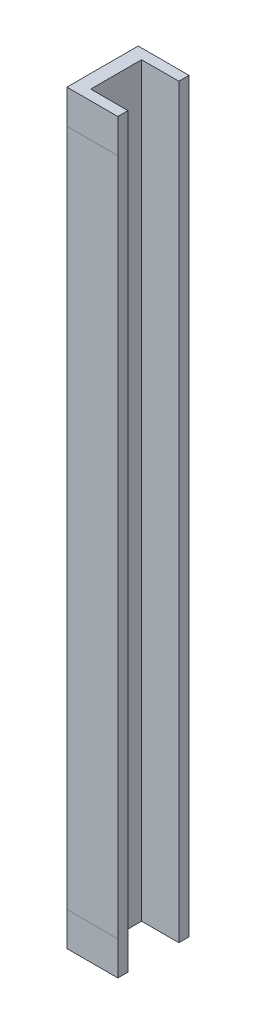
ISO-10303-21;
HEADER;
FILE_DESCRIPTION(('STEP AP214'),'2;1');
FILE_NAME('part.step','',(''),(''),'','','');
FILE_SCHEMA(('AUTOMOTIVE_DESIGN { 1 0 10303 214 1 1 1 1 }'));
ENDSEC;
DATA;
#1=APPLICATION_CONTEXT('core data for automotive mechanical design processes');
#2=APPLICATION_PROTOCOL_DEFINITION('international standard','automotive_design',2000,#1);
#3=PRODUCT_CONTEXT('',#1,'mechanical');
#4=PRODUCT('Part','Part','',(#3));
#5=PRODUCT_RELATED_PRODUCT_CATEGORY('part','',(#4));
#6=PRODUCT_DEFINITION_FORMATION('','',#4);
#7=PRODUCT_DEFINITION_CONTEXT('part definition',#1,'design');
#8=PRODUCT_DEFINITION('design','',#6,#7);
#9=PRODUCT_DEFINITION_SHAPE('','',#8);
#10=(LENGTH_UNIT() NAMED_UNIT(*) SI_UNIT(.MILLI.,.METRE.));
#11=(NAMED_UNIT(*) PLANE_ANGLE_UNIT() SI_UNIT($,.RADIAN.));
#12=(NAMED_UNIT(*) SI_UNIT($,.STERADIAN.) SOLID_ANGLE_UNIT());
#13=UNCERTAINTY_MEASURE_WITH_UNIT(LENGTH_MEASURE(1.E-05),#10,'distance_accuracy_value','');
#14=(GEOMETRIC_REPRESENTATION_CONTEXT(3) GLOBAL_UNCERTAINTY_ASSIGNED_CONTEXT((#13)) GLOBAL_UNIT_ASSIGNED_CONTEXT((#10,
#11,#12)) REPRESENTATION_CONTEXT('',''));
#15=CARTESIAN_POINT('',(0.,0.,0.));
#16=DIRECTION('',(0.,0.,1.));
#17=DIRECTION('',(1.,0.,0.));
#18=AXIS2_PLACEMENT_3D('',#15,#16,#17);
#19=CARTESIAN_POINT('',(0.,2200.,0.));
#20=DIRECTION('',(0.,0.,-1.));
#21=DIRECTION('',(-1.,0.,0.));
#22=AXIS2_PLACEMENT_3D('',#19,#20,#21);
#23=PLANE('',#22);
#24=DIRECTION('',(1.,0.,0.));
#25=VECTOR('',#24,1.);
#26=CARTESIAN_POINT('',(0.,100.,0.));
#27=LINE('',#26,#25);
#28=CARTESIAN_POINT('',(0.,100.,0.));
#29=VERTEX_POINT('',#28);
#30=CARTESIAN_POINT('',(150.,100.,0.));
#31=VERTEX_POINT('',#30);
#32=EDGE_CURVE('E12',#29,#31,#27,.T.);
#33=ORIENTED_EDGE('',*,*,#32,.F.);
#34=DIRECTION('',(0.,-1.,0.));
#35=VECTOR('',#34,1.);
#36=CARTESIAN_POINT('',(0.,2200.,0.));
#37=LINE('',#36,#35);
#38=CARTESIAN_POINT('',(0.,0.,0.));
#39=VERTEX_POINT('',#38);
#40=EDGE_CURVE('E160',#29,#39,#37,.T.);
#41=ORIENTED_EDGE('',*,*,#40,.T.);
#42=DIRECTION('',(1.,0.,0.));
#43=VECTOR('',#42,1.);
#44=CARTESIAN_POINT('',(0.,0.,0.));
#45=LINE('',#44,#43);
#46=CARTESIAN_POINT('',(150.,0.,0.));
#47=VERTEX_POINT('',#46);
#48=EDGE_CURVE('E221',#39,#47,#45,.T.);
#49=ORIENTED_EDGE('',*,*,#48,.T.);
#50=DIRECTION('',(0.,-1.,0.));
#51=VECTOR('',#50,1.);
#52=CARTESIAN_POINT('',(150.,2200.,0.));
#53=LINE('',#52,#51);
#54=EDGE_CURVE('E170',#31,#47,#53,.T.);
#55=ORIENTED_EDGE('',*,*,#54,.F.);
#56=EDGE_LOOP('',(#33,#41,#49,#55));
#57=FACE_BOUND('',#56,.T.);
#58=ADVANCED_FACE('F53',(#57),#23,.F.);
#59=CARTESIAN_POINT('',(0.,2100.,0.));
#60=VERTEX_POINT('',#59);
#61=EDGE_CURVE('E157',#60,#29,#37,.T.);
#62=ORIENTED_EDGE('',*,*,#61,.T.);
#63=ORIENTED_EDGE('',*,*,#32,.T.);
#64=CARTESIAN_POINT('',(150.,2100.,0.));
#65=VERTEX_POINT('',#64);
#66=EDGE_CURVE('E169',#65,#31,#53,.T.);
#67=ORIENTED_EDGE('',*,*,#66,.F.);
#68=DIRECTION('',(1.,0.,0.));
#69=VECTOR('',#68,1.);
#70=CARTESIAN_POINT('',(0.,2100.,0.));
#71=LINE('',#70,#69);
#72=EDGE_CURVE('E63',#60,#65,#71,.T.);
#73=ORIENTED_EDGE('',*,*,#72,.F.);
#74=EDGE_LOOP('',(#62,#63,#67,#73));
#75=FACE_BOUND('',#74,.T.);
#76=ADVANCED_FACE('F264',(#75),#23,.F.);
#77=CARTESIAN_POINT('',(0.,2200.,-210.));
#78=DIRECTION('',(1.,0.,0.));
#79=DIRECTION('',(0.,0.,-1.));
#80=AXIS2_PLACEMENT_3D('',#77,#78,#79);
#81=PLANE('',#80);
#82=DIRECTION('',(0.,0.,1.));
#83=VECTOR('',#82,1.);
#84=CARTESIAN_POINT('',(0.,0.,-210.));
#85=LINE('',#84,#83);
#86=CARTESIAN_POINT('',(0.,0.,-210.));
#87=VERTEX_POINT('',#86);
#88=EDGE_CURVE('E224',#87,#39,#85,.T.);
#89=ORIENTED_EDGE('',*,*,#88,.T.);
#90=ORIENTED_EDGE('',*,*,#40,.F.);
#91=ORIENTED_EDGE('',*,*,#61,.F.);
#92=CARTESIAN_POINT('',(0.,2200.,0.));
#93=VERTEX_POINT('',#92);
#94=EDGE_CURVE('E136',#93,#60,#37,.T.);
#95=ORIENTED_EDGE('',*,*,#94,.F.);
#96=DIRECTION('',(0.,0.,1.));
#97=VECTOR('',#96,1.);
#98=CARTESIAN_POINT('',(0.,2200.,-210.));
#99=LINE('',#98,#97);
#100=CARTESIAN_POINT('',(0.,2200.,-210.));
#101=VERTEX_POINT('',#100);
#102=EDGE_CURVE('E143',#101,#93,#99,.T.);
#103=ORIENTED_EDGE('',*,*,#102,.F.);
#104=DIRECTION('',(0.,-1.,0.));
#105=VECTOR('',#104,1.);
#106=CARTESIAN_POINT('',(0.,2200.,-210.));
#107=LINE('',#106,#105);
#108=EDGE_CURVE('E201',#101,#87,#107,.T.);
#109=ORIENTED_EDGE('',*,*,#108,.T.);
#110=EDGE_LOOP('',(#89,#90,#91,#95,#103,#109));
#111=FACE_BOUND('',#110,.T.);
#112=ADVANCED_FACE('F55',(#111),#81,.F.);
#113=ORIENTED_EDGE('',*,*,#94,.T.);
#114=ORIENTED_EDGE('',*,*,#72,.T.);
#115=CARTESIAN_POINT('',(150.,2200.,0.));
#116=VERTEX_POINT('',#115);
#117=EDGE_CURVE('E138',#116,#65,#53,.T.);
#118=ORIENTED_EDGE('',*,*,#117,.F.);
#119=DIRECTION('',(1.,0.,0.));
#120=VECTOR('',#119,1.);
#121=CARTESIAN_POINT('',(0.,2200.,0.));
#122=LINE('',#121,#120);
#123=EDGE_CURVE('E132',#93,#116,#122,.T.);
#124=ORIENTED_EDGE('',*,*,#123,.F.);
#125=EDGE_LOOP('',(#113,#114,#118,#124));
#126=FACE_BOUND('',#125,.T.);
#127=ADVANCED_FACE('F134',(#126),#23,.F.);
#128=CARTESIAN_POINT('',(150.,2200.,0.));
#129=DIRECTION('',(-1.,0.,0.));
#130=DIRECTION('',(0.,0.,1.));
#131=AXIS2_PLACEMENT_3D('',#128,#129,#130);
#132=PLANE('',#131);
#133=DIRECTION('',(0.,0.,-1.));
#134=VECTOR('',#133,1.);
#135=CARTESIAN_POINT('',(150.,0.,0.));
#136=LINE('',#135,#134);
#137=CARTESIAN_POINT('',(150.,0.,-30.));
#138=VERTEX_POINT('',#137);
#139=EDGE_CURVE('E218',#47,#138,#136,.T.);
#140=ORIENTED_EDGE('',*,*,#139,.T.);
#141=DIRECTION('',(0.,-1.,0.));
#142=VECTOR('',#141,1.);
#143=CARTESIAN_POINT('',(150.,2200.,-30.));
#144=LINE('',#143,#142);
#145=CARTESIAN_POINT('',(150.,2200.,-30.));
#146=VERTEX_POINT('',#145);
#147=EDGE_CURVE('E177',#146,#138,#144,.T.);
#148=ORIENTED_EDGE('',*,*,#147,.F.);
#149=DIRECTION('',(0.,0.,-1.));
#150=VECTOR('',#149,1.);
#151=CARTESIAN_POINT('',(150.,2200.,0.));
#152=LINE('',#151,#150);
#153=EDGE_CURVE('E142',#116,#146,#152,.T.);
#154=ORIENTED_EDGE('',*,*,#153,.F.);
#155=ORIENTED_EDGE('',*,*,#117,.T.);
#156=ORIENTED_EDGE('',*,*,#66,.T.);
#157=ORIENTED_EDGE('',*,*,#54,.T.);
#158=EDGE_LOOP('',(#140,#148,#154,#155,#156,#157));
#159=FACE_BOUND('',#158,.T.);
#160=ADVANCED_FACE('F263',(#159),#132,.F.);
#161=CARTESIAN_POINT('',(150.,2200.,-30.));
#162=DIRECTION('',(0.,0.,1.));
#163=DIRECTION('',(1.,0.,0.));
#164=AXIS2_PLACEMENT_3D('',#161,#162,#163);
#165=PLANE('',#164);
#166=DIRECTION('',(-1.,0.,0.));
#167=VECTOR('',#166,1.);
#168=CARTESIAN_POINT('',(150.,0.,-30.));
#169=LINE('',#168,#167);
#170=CARTESIAN_POINT('',(40.,0.,-30.));
#171=VERTEX_POINT('',#170);
#172=EDGE_CURVE('E215',#138,#171,#169,.T.);
#173=ORIENTED_EDGE('',*,*,#172,.T.);
#174=DIRECTION('',(0.,-1.,0.));
#175=VECTOR('',#174,1.);
#176=CARTESIAN_POINT('',(40.,2200.,-30.));
#177=LINE('',#176,#175);
#178=CARTESIAN_POINT('',(40.,2200.,-30.));
#179=VERTEX_POINT('',#178);
#180=EDGE_CURVE('E180',#179,#171,#177,.T.);
#181=ORIENTED_EDGE('',*,*,#180,.F.);
#182=DIRECTION('',(-1.,0.,0.));
#183=VECTOR('',#182,1.);
#184=CARTESIAN_POINT('',(150.,2200.,-30.));
#185=LINE('',#184,#183);
#186=EDGE_CURVE('E238',#146,#179,#185,.T.);
#187=ORIENTED_EDGE('',*,*,#186,.F.);
#188=ORIENTED_EDGE('',*,*,#147,.T.);
#189=EDGE_LOOP('',(#173,#181,#187,#188));
#190=FACE_BOUND('',#189,.T.);
#191=ADVANCED_FACE('F275',(#190),#165,.F.);
#192=CARTESIAN_POINT('',(40.,2200.,-30.));
#193=DIRECTION('',(-1.,0.,0.));
#194=DIRECTION('',(0.,0.,1.));
#195=AXIS2_PLACEMENT_3D('',#192,#193,#194);
#196=PLANE('',#195);
#197=DIRECTION('',(0.,0.,-1.));
#198=VECTOR('',#197,1.);
#199=CARTESIAN_POINT('',(40.,0.,-30.));
#200=LINE('',#199,#198);
#201=CARTESIAN_POINT('',(40.,0.,-180.));
#202=VERTEX_POINT('',#201);
#203=EDGE_CURVE('E212',#171,#202,#200,.T.);
#204=ORIENTED_EDGE('',*,*,#203,.T.);
#205=DIRECTION('',(0.,-1.,0.));
#206=VECTOR('',#205,1.);
#207=CARTESIAN_POINT('',(40.,2200.,-180.));
#208=LINE('',#207,#206);
#209=CARTESIAN_POINT('',(40.,2200.,-180.));
#210=VERTEX_POINT('',#209);
#211=EDGE_CURVE('E187',#210,#202,#208,.T.);
#212=ORIENTED_EDGE('',*,*,#211,.F.);
#213=DIRECTION('',(0.,0.,-1.));
#214=VECTOR('',#213,1.);
#215=CARTESIAN_POINT('',(40.,2200.,-30.));
#216=LINE('',#215,#214);
#217=EDGE_CURVE('E241',#179,#210,#216,.T.);
#218=ORIENTED_EDGE('',*,*,#217,.F.);
#219=ORIENTED_EDGE('',*,*,#180,.T.);
#220=EDGE_LOOP('',(#204,#212,#218,#219));
#221=FACE_BOUND('',#220,.T.);
#222=ADVANCED_FACE('F279',(#221),#196,.F.);
#223=CARTESIAN_POINT('',(40.,2200.,-180.));
#224=DIRECTION('',(0.,0.,-1.));
#225=DIRECTION('',(-1.,0.,0.));
#226=AXIS2_PLACEMENT_3D('',#223,#224,#225);
#227=PLANE('',#226);
#228=DIRECTION('',(1.,0.,0.));
#229=VECTOR('',#228,1.);
#230=CARTESIAN_POINT('',(40.,0.,-180.));
#231=LINE('',#230,#229);
#232=CARTESIAN_POINT('',(150.,0.,-180.));
#233=VERTEX_POINT('',#232);
#234=EDGE_CURVE('E209',#202,#233,#231,.T.);
#235=ORIENTED_EDGE('',*,*,#234,.T.);
#236=DIRECTION('',(0.,-1.,0.));
#237=VECTOR('',#236,1.);
#238=CARTESIAN_POINT('',(150.,2200.,-180.));
#239=LINE('',#238,#237);
#240=CARTESIAN_POINT('',(150.,2200.,-180.));
#241=VERTEX_POINT('',#240);
#242=EDGE_CURVE('E193',#241,#233,#239,.T.);
#243=ORIENTED_EDGE('',*,*,#242,.F.);
#244=DIRECTION('',(1.,0.,0.));
#245=VECTOR('',#244,1.);
#246=CARTESIAN_POINT('',(40.,2200.,-180.));
#247=LINE('',#246,#245);
#248=EDGE_CURVE('E244',#210,#241,#247,.T.);
#249=ORIENTED_EDGE('',*,*,#248,.F.);
#250=ORIENTED_EDGE('',*,*,#211,.T.);
#251=EDGE_LOOP('',(#235,#243,#249,#250));
#252=FACE_BOUND('',#251,.T.);
#253=ADVANCED_FACE('F284',(#252),#227,.F.);
#254=CARTESIAN_POINT('',(150.,2200.,-180.));
#255=DIRECTION('',(-1.,0.,0.));
#256=DIRECTION('',(0.,0.,1.));
#257=AXIS2_PLACEMENT_3D('',#254,#255,#256);
#258=PLANE('',#257);
#259=DIRECTION('',(0.,0.,-1.));
#260=VECTOR('',#259,1.);
#261=CARTESIAN_POINT('',(150.,0.,-180.));
#262=LINE('',#261,#260);
#263=CARTESIAN_POINT('',(150.,0.,-210.));
#264=VERTEX_POINT('',#263);
#265=EDGE_CURVE('E206',#233,#264,#262,.T.);
#266=ORIENTED_EDGE('',*,*,#265,.T.);
#267=DIRECTION('',(0.,-1.,0.));
#268=VECTOR('',#267,1.);
#269=CARTESIAN_POINT('',(150.,2200.,-210.));
#270=LINE('',#269,#268);
#271=CARTESIAN_POINT('',(150.,2200.,-210.));
#272=VERTEX_POINT('',#271);
#273=EDGE_CURVE('E197',#272,#264,#270,.T.);
#274=ORIENTED_EDGE('',*,*,#273,.F.);
#275=DIRECTION('',(0.,0.,-1.));
#276=VECTOR('',#275,1.);
#277=CARTESIAN_POINT('',(150.,2200.,-180.));
#278=LINE('',#277,#276);
#279=EDGE_CURVE('E246',#241,#272,#278,.T.);
#280=ORIENTED_EDGE('',*,*,#279,.F.);
#281=ORIENTED_EDGE('',*,*,#242,.T.);
#282=EDGE_LOOP('',(#266,#274,#280,#281));
#283=FACE_BOUND('',#282,.T.);
#284=ADVANCED_FACE('F254',(#283),#258,.F.);
#285=CARTESIAN_POINT('',(150.,2200.,-210.));
#286=DIRECTION('',(0.,0.,1.));
#287=DIRECTION('',(1.,0.,0.));
#288=AXIS2_PLACEMENT_3D('',#285,#286,#287);
#289=PLANE('',#288);
#290=DIRECTION('',(-1.,0.,0.));
#291=VECTOR('',#290,1.);
#292=CARTESIAN_POINT('',(150.,0.,-210.));
#293=LINE('',#292,#291);
#294=EDGE_CURVE('E153',#264,#87,#293,.T.);
#295=ORIENTED_EDGE('',*,*,#294,.T.);
#296=ORIENTED_EDGE('',*,*,#108,.F.);
#297=DIRECTION('',(-1.,0.,0.));
#298=VECTOR('',#297,1.);
#299=CARTESIAN_POINT('',(150.,2200.,-210.));
#300=LINE('',#299,#298);
#301=EDGE_CURVE('E148',#272,#101,#300,.T.);
#302=ORIENTED_EDGE('',*,*,#301,.F.);
#303=ORIENTED_EDGE('',*,*,#273,.T.);
#304=EDGE_LOOP('',(#295,#296,#302,#303));
#305=FACE_BOUND('',#304,.T.);
#306=ADVANCED_FACE('F258',(#305),#289,.F.);
#307=CARTESIAN_POINT('',(0.,2200.,0.));
#308=DIRECTION('',(0.,1.,0.));
#309=DIRECTION('',(0.,0.,1.));
#310=AXIS2_PLACEMENT_3D('',#307,#308,#309);
#311=PLANE('',#310);
#312=ORIENTED_EDGE('',*,*,#102,.T.);
#313=ORIENTED_EDGE('',*,*,#123,.T.);
#314=ORIENTED_EDGE('',*,*,#153,.T.);
#315=ORIENTED_EDGE('',*,*,#186,.T.);
#316=ORIENTED_EDGE('',*,*,#217,.T.);
#317=ORIENTED_EDGE('',*,*,#248,.T.);
#318=ORIENTED_EDGE('',*,*,#279,.T.);
#319=ORIENTED_EDGE('',*,*,#301,.T.);
#320=EDGE_LOOP('',(#312,#313,#314,#315,#316,#317,#318,#319));
#321=FACE_BOUND('',#320,.T.);
#322=ADVANCED_FACE('F146',(#321),#311,.T.);
#323=CARTESIAN_POINT('',(0.,0.,0.));
#324=DIRECTION('',(0.,1.,0.));
#325=DIRECTION('',(0.,0.,1.));
#326=AXIS2_PLACEMENT_3D('',#323,#324,#325);
#327=PLANE('',#326);
#328=ORIENTED_EDGE('',*,*,#88,.F.);
#329=ORIENTED_EDGE('',*,*,#294,.F.);
#330=ORIENTED_EDGE('',*,*,#265,.F.);
#331=ORIENTED_EDGE('',*,*,#234,.F.);
#332=ORIENTED_EDGE('',*,*,#203,.F.);
#333=ORIENTED_EDGE('',*,*,#172,.F.);
#334=ORIENTED_EDGE('',*,*,#139,.F.);
#335=ORIENTED_EDGE('',*,*,#48,.F.);
#336=EDGE_LOOP('',(#328,#329,#330,#331,#332,#333,#334,#335));
#337=FACE_BOUND('',#336,.T.);
#338=ADVANCED_FACE('F261',(#337),#327,.F.);
#339=CLOSED_SHELL('',(#58,#76,#112,#127,#160,#191,#222,#253,#284,#306,#322,#338));
#340=MANIFOLD_SOLID_BREP('B2',#339);
#341=ADVANCED_BREP_SHAPE_REPRESENTATION('',(#18,#340),#14);
#342=SHAPE_DEFINITION_REPRESENTATION(#9,#341);
ENDSEC;
END-ISO-10303-21;
